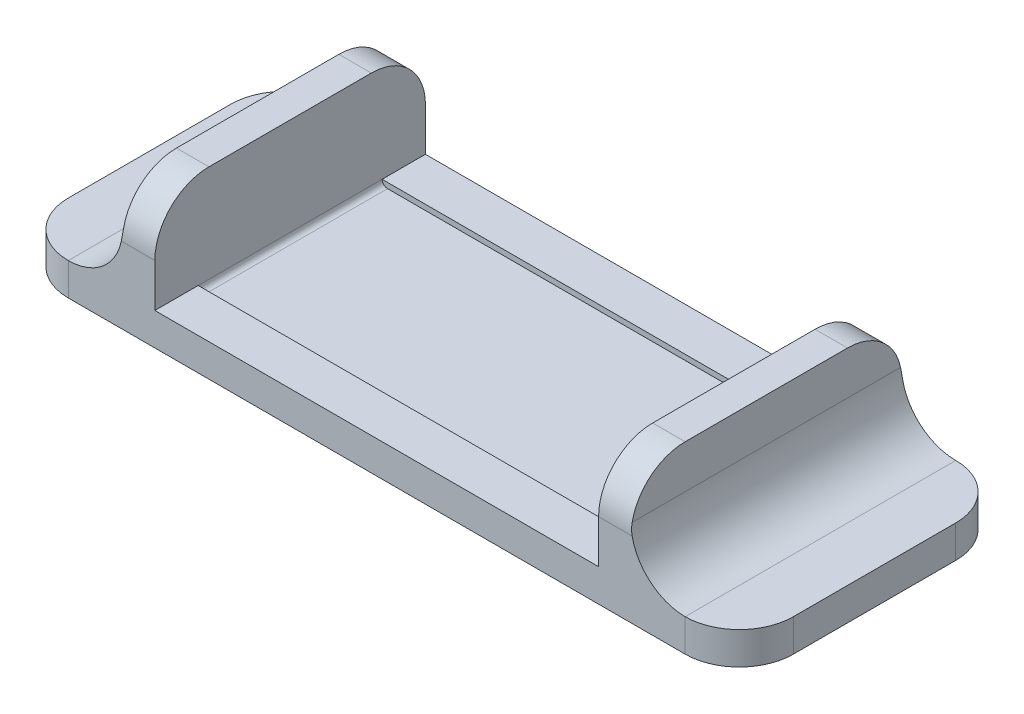
ISO-10303-21;
HEADER;
FILE_DESCRIPTION(('STEP AP214'),'2;1');
FILE_NAME('part.step','',(''),(''),'','','');
FILE_SCHEMA(('AUTOMOTIVE_DESIGN { 1 0 10303 214 1 1 1 1 }'));
ENDSEC;
DATA;
#1=APPLICATION_CONTEXT('core data for automotive mechanical design processes');
#2=APPLICATION_PROTOCOL_DEFINITION('international standard','automotive_design',2000,#1);
#3=PRODUCT_CONTEXT('',#1,'mechanical');
#4=PRODUCT('Part','Part','',(#3));
#5=PRODUCT_RELATED_PRODUCT_CATEGORY('part','',(#4));
#6=PRODUCT_DEFINITION_FORMATION('','',#4);
#7=PRODUCT_DEFINITION_CONTEXT('part definition',#1,'design');
#8=PRODUCT_DEFINITION('design','',#6,#7);
#9=PRODUCT_DEFINITION_SHAPE('','',#8);
#10=(LENGTH_UNIT() NAMED_UNIT(*) SI_UNIT(.MILLI.,.METRE.));
#11=(NAMED_UNIT(*) PLANE_ANGLE_UNIT() SI_UNIT($,.RADIAN.));
#12=(NAMED_UNIT(*) SI_UNIT($,.STERADIAN.) SOLID_ANGLE_UNIT());
#13=UNCERTAINTY_MEASURE_WITH_UNIT(LENGTH_MEASURE(1.E-05),#10,'distance_accuracy_value','');
#14=(GEOMETRIC_REPRESENTATION_CONTEXT(3) GLOBAL_UNCERTAINTY_ASSIGNED_CONTEXT((#13)) GLOBAL_UNIT_ASSIGNED_CONTEXT((#10,
#11,#12)) REPRESENTATION_CONTEXT('',''));
#15=CARTESIAN_POINT('',(0.,0.,0.));
#16=DIRECTION('',(0.,0.,1.));
#17=DIRECTION('',(1.,0.,0.));
#18=AXIS2_PLACEMENT_3D('',#15,#16,#17);
#19=CARTESIAN_POINT('',(0.,0.,50.));
#20=DIRECTION('',(0.,-1.,0.));
#21=DIRECTION('',(0.,0.,-1.));
#22=AXIS2_PLACEMENT_3D('',#19,#20,#21);
#23=PLANE('',#22);
#24=DIRECTION('',(1.,0.,0.));
#25=VECTOR('',#24,1.);
#26=CARTESIAN_POINT('',(0.,0.,8.));
#27=LINE('',#26,#25);
#28=CARTESIAN_POINT('',(0.,0.,8.));
#29=VERTEX_POINT('',#28);
#30=CARTESIAN_POINT('',(82.,0.,8.));
#31=VERTEX_POINT('',#30);
#32=EDGE_CURVE('E219',#29,#31,#27,.T.);
#33=ORIENTED_EDGE('',*,*,#32,.T.);
#34=DIRECTION('',(0.,0.,-1.));
#35=VECTOR('',#34,1.);
#36=CARTESIAN_POINT('',(82.,0.,50.));
#37=LINE('',#36,#35);
#38=CARTESIAN_POINT('',(82.,0.,0.));
#39=VERTEX_POINT('',#38);
#40=EDGE_CURVE('E206',#31,#39,#37,.T.);
#41=ORIENTED_EDGE('',*,*,#40,.T.);
#42=DIRECTION('',(-1.,0.,0.));
#43=VECTOR('',#42,1.);
#44=CARTESIAN_POINT('',(0.,0.,0.));
#45=LINE('',#44,#43);
#46=CARTESIAN_POINT('',(0.,0.,0.));
#47=VERTEX_POINT('',#46);
#48=EDGE_CURVE('E477',#39,#47,#45,.T.);
#49=ORIENTED_EDGE('',*,*,#48,.T.);
#50=DIRECTION('',(0.,0.,-1.));
#51=VECTOR('',#50,1.);
#52=CARTESIAN_POINT('',(0.,0.,50.));
#53=LINE('',#52,#51);
#54=EDGE_CURVE('E486',#29,#47,#53,.T.);
#55=ORIENTED_EDGE('',*,*,#54,.F.);
#56=EDGE_LOOP('',(#33,#41,#49,#55));
#57=FACE_BOUND('',#56,.T.);
#58=ADVANCED_FACE('F35',(#57),#23,.F.);
#59=CARTESIAN_POINT('',(0.,0.,50.));
#60=DIRECTION('',(-1.,0.,0.));
#61=DIRECTION('',(0.,0.,1.));
#62=AXIS2_PLACEMENT_3D('',#59,#60,#61);
#63=PLANE('',#62);
#64=CARTESIAN_POINT('',(0.,0.,50.));
#65=VERTEX_POINT('',#64);
#66=CARTESIAN_POINT('',(0.,0.,42.));
#67=VERTEX_POINT('',#66);
#68=EDGE_CURVE('E485',#65,#67,#53,.T.);
#69=ORIENTED_EDGE('',*,*,#68,.T.);
#70=DIRECTION('',(0.,0.,1.));
#71=VECTOR('',#70,1.);
#72=CARTESIAN_POINT('',(0.,0.,50.));
#73=LINE('',#72,#71);
#74=EDGE_CURVE('E11',#67,#29,#73,.F.);
#75=ORIENTED_EDGE('',*,*,#74,.T.);
#76=ORIENTED_EDGE('',*,*,#54,.T.);
#77=DIRECTION('',(0.,1.,0.));
#78=VECTOR('',#77,1.);
#79=CARTESIAN_POINT('',(0.,0.,0.));
#80=LINE('',#79,#78);
#81=CARTESIAN_POINT('',(0.,8.,0.));
#82=VERTEX_POINT('',#81);
#83=EDGE_CURVE('E475',#47,#82,#80,.T.);
#84=ORIENTED_EDGE('',*,*,#83,.T.);
#85=CARTESIAN_POINT('',(0.,8.,10.));
#86=DIRECTION('',(-1.,0.,0.));
#87=DIRECTION('',(0.,0.,1.));
#88=AXIS2_PLACEMENT_3D('',#85,#86,#87);
#89=CIRCLE('',#88,10.);
#90=CARTESIAN_POINT('',(0.,18.,10.));
#91=VERTEX_POINT('',#90);
#92=EDGE_CURVE('E235',#82,#91,#89,.F.);
#93=ORIENTED_EDGE('',*,*,#92,.T.);
#94=DIRECTION('',(0.,0.,-1.));
#95=VECTOR('',#94,1.);
#96=CARTESIAN_POINT('',(0.,18.,50.));
#97=LINE('',#96,#95);
#98=CARTESIAN_POINT('',(0.,18.,40.));
#99=VERTEX_POINT('',#98);
#100=EDGE_CURVE('E335',#99,#91,#97,.T.);
#101=ORIENTED_EDGE('',*,*,#100,.F.);
#102=CARTESIAN_POINT('',(0.,8.,40.));
#103=DIRECTION('',(-1.,0.,0.));
#104=DIRECTION('',(0.,0.,1.));
#105=AXIS2_PLACEMENT_3D('',#102,#103,#104);
#106=CIRCLE('',#105,10.);
#107=CARTESIAN_POINT('',(0.,8.,50.));
#108=VERTEX_POINT('',#107);
#109=EDGE_CURVE('E237',#99,#108,#106,.F.);
#110=ORIENTED_EDGE('',*,*,#109,.T.);
#111=DIRECTION('',(0.,1.,0.));
#112=VECTOR('',#111,1.);
#113=CARTESIAN_POINT('',(0.,0.,50.));
#114=LINE('',#113,#112);
#115=EDGE_CURVE('E484',#65,#108,#114,.T.);
#116=ORIENTED_EDGE('',*,*,#115,.F.);
#117=EDGE_LOOP('',(#69,#75,#76,#84,#93,#101,#110,#116));
#118=FACE_BOUND('',#117,.T.);
#119=ADVANCED_FACE('F339',(#118),#63,.F.);
#120=CARTESIAN_POINT('',(-6.,18.,50.));
#121=DIRECTION('',(0.,-1.,0.));
#122=DIRECTION('',(0.,0.,-1.));
#123=AXIS2_PLACEMENT_3D('',#120,#121,#122);
#124=PLANE('',#123);
#125=ORIENTED_EDGE('',*,*,#100,.T.);
#126=DIRECTION('',(-1.,0.,0.));
#127=VECTOR('',#126,1.);
#128=CARTESIAN_POINT('',(-6.,18.,10.));
#129=LINE('',#128,#127);
#130=CARTESIAN_POINT('',(-6.,18.,10.));
#131=VERTEX_POINT('',#130);
#132=EDGE_CURVE('E305',#91,#131,#129,.T.);
#133=ORIENTED_EDGE('',*,*,#132,.T.);
#134=DIRECTION('',(0.,0.,-1.));
#135=VECTOR('',#134,1.);
#136=CARTESIAN_POINT('',(-6.,18.,50.));
#137=LINE('',#136,#135);
#138=CARTESIAN_POINT('',(-6.,18.,40.));
#139=VERTEX_POINT('',#138);
#140=EDGE_CURVE('E337',#139,#131,#137,.T.);
#141=ORIENTED_EDGE('',*,*,#140,.F.);
#142=DIRECTION('',(-1.,0.,0.));
#143=VECTOR('',#142,1.);
#144=CARTESIAN_POINT('',(-6.,18.,40.));
#145=LINE('',#144,#143);
#146=EDGE_CURVE('E303',#139,#99,#145,.F.);
#147=ORIENTED_EDGE('',*,*,#146,.T.);
#148=EDGE_LOOP('',(#125,#133,#141,#147));
#149=FACE_BOUND('',#148,.T.);
#150=ADVANCED_FACE('F334',(#149),#124,.F.);
#151=CARTESIAN_POINT('',(-6.,0.,50.));
#152=DIRECTION('',(1.,0.,0.));
#153=DIRECTION('',(0.,0.,-1.));
#154=AXIS2_PLACEMENT_3D('',#151,#152,#153);
#155=PLANE('',#154);
#156=ORIENTED_EDGE('',*,*,#140,.T.);
#157=CARTESIAN_POINT('',(-6.,8.,10.));
#158=DIRECTION('',(1.,0.,0.));
#159=DIRECTION('',(0.,0.,-1.));
#160=AXIS2_PLACEMENT_3D('',#157,#158,#159);
#161=CIRCLE('',#160,10.);
#162=CARTESIAN_POINT('',(-6.,10.,0.202041028867289));
#163=VERTEX_POINT('',#162);
#164=EDGE_CURVE('E309',#131,#163,#161,.F.);
#165=ORIENTED_EDGE('',*,*,#164,.T.);
#166=DIRECTION('',(0.,0.,-1.));
#167=VECTOR('',#166,1.);
#168=CARTESIAN_POINT('',(-6.,10.,50.));
#169=LINE('',#168,#167);
#170=CARTESIAN_POINT('',(-6.,10.,49.7979589711327));
#171=VERTEX_POINT('',#170);
#172=EDGE_CURVE('E315',#163,#171,#169,.F.);
#173=ORIENTED_EDGE('',*,*,#172,.T.);
#174=CARTESIAN_POINT('',(-6.,8.,40.));
#175=DIRECTION('',(1.,0.,0.));
#176=DIRECTION('',(0.,0.,-1.));
#177=AXIS2_PLACEMENT_3D('',#174,#175,#176);
#178=CIRCLE('',#177,10.);
#179=EDGE_CURVE('E308',#171,#139,#178,.F.);
#180=ORIENTED_EDGE('',*,*,#179,.T.);
#181=EDGE_LOOP('',(#156,#165,#173,#180));
#182=FACE_BOUND('',#181,.T.);
#183=ADVANCED_FACE('F323',(#182),#155,.F.);
#184=CARTESIAN_POINT('',(-26.,0.,50.));
#185=DIRECTION('',(0.,-1.,0.));
#186=DIRECTION('',(0.,0.,-1.));
#187=AXIS2_PLACEMENT_3D('',#184,#185,#186);
#188=PLANE('',#187);
#189=DIRECTION('',(0.,0.,-1.));
#190=VECTOR('',#189,1.);
#191=CARTESIAN_POINT('',(-16.,0.,0.));
#192=LINE('',#191,#190);
#193=CARTESIAN_POINT('',(-16.,0.,50.));
#194=VERTEX_POINT('',#193);
#195=CARTESIAN_POINT('',(-16.,0.,0.));
#196=VERTEX_POINT('',#195);
#197=EDGE_CURVE('E363',#194,#196,#192,.T.);
#198=ORIENTED_EDGE('',*,*,#197,.T.);
#199=CARTESIAN_POINT('',(-16.,0.,10.));
#200=DIRECTION('',(0.,-1.,0.));
#201=DIRECTION('',(0.,0.,-1.));
#202=AXIS2_PLACEMENT_3D('',#199,#200,#201);
#203=CIRCLE('',#202,10.);
#204=CARTESIAN_POINT('',(-26.,0.,10.));
#205=VERTEX_POINT('',#204);
#206=EDGE_CURVE('E326',#196,#205,#203,.F.);
#207=ORIENTED_EDGE('',*,*,#206,.T.);
#208=DIRECTION('',(0.,0.,-1.));
#209=VECTOR('',#208,1.);
#210=CARTESIAN_POINT('',(-26.,0.,50.));
#211=LINE('',#210,#209);
#212=CARTESIAN_POINT('',(-26.,0.,40.));
#213=VERTEX_POINT('',#212);
#214=EDGE_CURVE('E349',#213,#205,#211,.T.);
#215=ORIENTED_EDGE('',*,*,#214,.F.);
#216=CARTESIAN_POINT('',(-16.,0.,40.));
#217=DIRECTION('',(0.,-1.,0.));
#218=DIRECTION('',(0.,0.,-1.));
#219=AXIS2_PLACEMENT_3D('',#216,#217,#218);
#220=CIRCLE('',#219,10.);
#221=EDGE_CURVE('E360',#213,#194,#220,.F.);
#222=ORIENTED_EDGE('',*,*,#221,.T.);
#223=EDGE_LOOP('',(#198,#207,#215,#222));
#224=FACE_BOUND('',#223,.T.);
#225=ADVANCED_FACE('F695',(#224),#188,.F.);
#226=CARTESIAN_POINT('',(-26.,-6.,50.));
#227=DIRECTION('',(1.,0.,0.));
#228=DIRECTION('',(0.,0.,-1.));
#229=AXIS2_PLACEMENT_3D('',#226,#227,#228);
#230=PLANE('',#229);
#231=ORIENTED_EDGE('',*,*,#214,.T.);
#232=DIRECTION('',(0.,-1.,0.));
#233=VECTOR('',#232,1.);
#234=CARTESIAN_POINT('',(-26.,-6.,10.));
#235=LINE('',#234,#233);
#236=CARTESIAN_POINT('',(-26.,-6.,10.));
#237=VERTEX_POINT('',#236);
#238=EDGE_CURVE('E392',#205,#237,#235,.T.);
#239=ORIENTED_EDGE('',*,*,#238,.T.);
#240=DIRECTION('',(0.,0.,-1.));
#241=VECTOR('',#240,1.);
#242=CARTESIAN_POINT('',(-26.,-6.,50.));
#243=LINE('',#242,#241);
#244=CARTESIAN_POINT('',(-26.,-6.,40.));
#245=VERTEX_POINT('',#244);
#246=EDGE_CURVE('E452',#245,#237,#243,.T.);
#247=ORIENTED_EDGE('',*,*,#246,.F.);
#248=DIRECTION('',(0.,-1.,0.));
#249=VECTOR('',#248,1.);
#250=CARTESIAN_POINT('',(-26.,-6.,40.));
#251=LINE('',#250,#249);
#252=EDGE_CURVE('E390',#245,#213,#251,.F.);
#253=ORIENTED_EDGE('',*,*,#252,.T.);
#254=EDGE_LOOP('',(#231,#239,#247,#253));
#255=FACE_BOUND('',#254,.T.);
#256=ADVANCED_FACE('F458',(#255),#230,.F.);
#257=CARTESIAN_POINT('',(108.,-6.,50.));
#258=DIRECTION('',(0.,1.,0.));
#259=DIRECTION('',(0.,0.,1.));
#260=AXIS2_PLACEMENT_3D('',#257,#258,#259);
#261=PLANE('',#260);
#262=DIRECTION('',(1.,0.,0.));
#263=VECTOR('',#262,1.);
#264=CARTESIAN_POINT('',(108.,-6.,0.));
#265=LINE('',#264,#263);
#266=CARTESIAN_POINT('',(-16.,-6.,0.));
#267=VERTEX_POINT('',#266);
#268=CARTESIAN_POINT('',(98.,-6.,0.));
#269=VERTEX_POINT('',#268);
#270=EDGE_CURVE('E469',#267,#269,#265,.T.);
#271=ORIENTED_EDGE('',*,*,#270,.T.);
#272=CARTESIAN_POINT('',(98.,-6.,10.));
#273=DIRECTION('',(0.,1.,0.));
#274=DIRECTION('',(0.,0.,1.));
#275=AXIS2_PLACEMENT_3D('',#272,#273,#274);
#276=CIRCLE('',#275,10.);
#277=CARTESIAN_POINT('',(108.,-6.,10.));
#278=VERTEX_POINT('',#277);
#279=EDGE_CURVE('E382',#269,#278,#276,.F.);
#280=ORIENTED_EDGE('',*,*,#279,.T.);
#281=DIRECTION('',(0.,0.,-1.));
#282=VECTOR('',#281,1.);
#283=CARTESIAN_POINT('',(108.,-6.,50.));
#284=LINE('',#283,#282);
#285=CARTESIAN_POINT('',(108.,-6.,40.));
#286=VERTEX_POINT('',#285);
#287=EDGE_CURVE('E449',#286,#278,#284,.T.);
#288=ORIENTED_EDGE('',*,*,#287,.F.);
#289=CARTESIAN_POINT('',(98.,-6.,40.));
#290=DIRECTION('',(0.,1.,0.));
#291=DIRECTION('',(0.,0.,1.));
#292=AXIS2_PLACEMENT_3D('',#289,#290,#291);
#293=CIRCLE('',#292,10.);
#294=CARTESIAN_POINT('',(98.,-6.,50.));
#295=VERTEX_POINT('',#294);
#296=EDGE_CURVE('E380',#286,#295,#293,.F.);
#297=ORIENTED_EDGE('',*,*,#296,.T.);
#298=DIRECTION('',(1.,0.,0.));
#299=VECTOR('',#298,1.);
#300=CARTESIAN_POINT('',(-6.,-6.,50.));
#301=LINE('',#300,#299);
#302=CARTESIAN_POINT('',(-16.,-6.,50.));
#303=VERTEX_POINT('',#302);
#304=EDGE_CURVE('E491',#303,#295,#301,.T.);
#305=ORIENTED_EDGE('',*,*,#304,.F.);
#306=CARTESIAN_POINT('',(-16.,-6.,40.));
#307=DIRECTION('',(0.,1.,0.));
#308=DIRECTION('',(0.,0.,1.));
#309=AXIS2_PLACEMENT_3D('',#306,#307,#308);
#310=CIRCLE('',#309,10.);
#311=EDGE_CURVE('E376',#303,#245,#310,.F.);
#312=ORIENTED_EDGE('',*,*,#311,.T.);
#313=ORIENTED_EDGE('',*,*,#246,.T.);
#314=CARTESIAN_POINT('',(-16.,-6.,10.));
#315=DIRECTION('',(0.,1.,0.));
#316=DIRECTION('',(0.,0.,1.));
#317=AXIS2_PLACEMENT_3D('',#314,#315,#316);
#318=CIRCLE('',#317,10.);
#319=EDGE_CURVE('E378',#237,#267,#318,.F.);
#320=ORIENTED_EDGE('',*,*,#319,.T.);
#321=EDGE_LOOP('',(#271,#280,#288,#297,#305,#312,#313,#320));
#322=FACE_BOUND('',#321,.T.);
#323=ADVANCED_FACE('F468',(#322),#261,.F.);
#324=CARTESIAN_POINT('',(108.,0.,50.));
#325=DIRECTION('',(-1.,0.,0.));
#326=DIRECTION('',(0.,0.,1.));
#327=AXIS2_PLACEMENT_3D('',#324,#325,#326);
#328=PLANE('',#327);
#329=ORIENTED_EDGE('',*,*,#287,.T.);
#330=DIRECTION('',(0.,1.,0.));
#331=VECTOR('',#330,1.);
#332=CARTESIAN_POINT('',(108.,0.,10.));
#333=LINE('',#332,#331);
#334=CARTESIAN_POINT('',(108.,0.,10.));
#335=VERTEX_POINT('',#334);
#336=EDGE_CURVE('E368',#278,#335,#333,.T.);
#337=ORIENTED_EDGE('',*,*,#336,.T.);
#338=DIRECTION('',(0.,0.,-1.));
#339=VECTOR('',#338,1.);
#340=CARTESIAN_POINT('',(108.,0.,50.));
#341=LINE('',#340,#339);
#342=CARTESIAN_POINT('',(108.,0.,40.));
#343=VERTEX_POINT('',#342);
#344=EDGE_CURVE('E443',#343,#335,#341,.T.);
#345=ORIENTED_EDGE('',*,*,#344,.F.);
#346=DIRECTION('',(0.,1.,0.));
#347=VECTOR('',#346,1.);
#348=CARTESIAN_POINT('',(108.,0.,40.));
#349=LINE('',#348,#347);
#350=EDGE_CURVE('E325',#343,#286,#349,.F.);
#351=ORIENTED_EDGE('',*,*,#350,.T.);
#352=EDGE_LOOP('',(#329,#337,#345,#351));
#353=FACE_BOUND('',#352,.T.);
#354=ADVANCED_FACE('F525',(#353),#328,.F.);
#355=CARTESIAN_POINT('',(88.,0.,50.));
#356=DIRECTION('',(0.,-1.,0.));
#357=DIRECTION('',(0.,0.,-1.));
#358=AXIS2_PLACEMENT_3D('',#355,#356,#357);
#359=PLANE('',#358);
#360=ORIENTED_EDGE('',*,*,#344,.T.);
#361=CARTESIAN_POINT('',(98.,0.,10.));
#362=DIRECTION('',(0.,-1.,0.));
#363=DIRECTION('',(0.,0.,-1.));
#364=AXIS2_PLACEMENT_3D('',#361,#362,#363);
#365=CIRCLE('',#364,10.);
#366=CARTESIAN_POINT('',(98.,0.,0.));
#367=VERTEX_POINT('',#366);
#368=EDGE_CURVE('E357',#335,#367,#365,.F.);
#369=ORIENTED_EDGE('',*,*,#368,.T.);
#370=DIRECTION('',(0.,0.,-1.));
#371=VECTOR('',#370,1.);
#372=CARTESIAN_POINT('',(98.,0.,50.));
#373=LINE('',#372,#371);
#374=CARTESIAN_POINT('',(98.,0.,50.));
#375=VERTEX_POINT('',#374);
#376=EDGE_CURVE('E354',#367,#375,#373,.F.);
#377=ORIENTED_EDGE('',*,*,#376,.T.);
#378=CARTESIAN_POINT('',(98.,0.,40.));
#379=DIRECTION('',(0.,-1.,0.));
#380=DIRECTION('',(0.,0.,-1.));
#381=AXIS2_PLACEMENT_3D('',#378,#379,#380);
#382=CIRCLE('',#381,10.);
#383=EDGE_CURVE('E347',#375,#343,#382,.F.);
#384=ORIENTED_EDGE('',*,*,#383,.T.);
#385=EDGE_LOOP('',(#360,#369,#377,#384));
#386=FACE_BOUND('',#385,.T.);
#387=ADVANCED_FACE('F521',(#386),#359,.F.);
#388=CARTESIAN_POINT('',(88.,18.,50.));
#389=DIRECTION('',(-1.,0.,0.));
#390=DIRECTION('',(0.,0.,1.));
#391=AXIS2_PLACEMENT_3D('',#388,#389,#390);
#392=PLANE('',#391);
#393=DIRECTION('',(0.,0.,-1.));
#394=VECTOR('',#393,1.);
#395=CARTESIAN_POINT('',(88.,18.,50.));
#396=LINE('',#395,#394);
#397=CARTESIAN_POINT('',(88.,18.,40.));
#398=VERTEX_POINT('',#397);
#399=CARTESIAN_POINT('',(88.,18.,10.));
#400=VERTEX_POINT('',#399);
#401=EDGE_CURVE('E440',#398,#400,#396,.T.);
#402=ORIENTED_EDGE('',*,*,#401,.F.);
#403=CARTESIAN_POINT('',(88.,8.,40.));
#404=DIRECTION('',(-1.,0.,0.));
#405=DIRECTION('',(0.,0.,1.));
#406=AXIS2_PLACEMENT_3D('',#403,#404,#405);
#407=CIRCLE('',#406,10.);
#408=CARTESIAN_POINT('',(88.,10.,49.7979589711327));
#409=VERTEX_POINT('',#408);
#410=EDGE_CURVE('E419',#398,#409,#407,.F.);
#411=ORIENTED_EDGE('',*,*,#410,.T.);
#412=DIRECTION('',(0.,0.,-1.));
#413=VECTOR('',#412,1.);
#414=CARTESIAN_POINT('',(88.,10.,0.));
#415=LINE('',#414,#413);
#416=CARTESIAN_POINT('',(88.,10.,0.202041028867289));
#417=VERTEX_POINT('',#416);
#418=EDGE_CURVE('E344',#409,#417,#415,.T.);
#419=ORIENTED_EDGE('',*,*,#418,.T.);
#420=CARTESIAN_POINT('',(88.,8.,10.));
#421=DIRECTION('',(-1.,0.,0.));
#422=DIRECTION('',(0.,0.,1.));
#423=AXIS2_PLACEMENT_3D('',#420,#421,#422);
#424=CIRCLE('',#423,10.);
#425=EDGE_CURVE('E418',#417,#400,#424,.F.);
#426=ORIENTED_EDGE('',*,*,#425,.T.);
#427=EDGE_LOOP('',(#402,#411,#419,#426));
#428=FACE_BOUND('',#427,.T.);
#429=ADVANCED_FACE('F432',(#428),#392,.F.);
#430=CARTESIAN_POINT('',(82.,18.,50.));
#431=DIRECTION('',(0.,-1.,0.));
#432=DIRECTION('',(0.,0.,-1.));
#433=AXIS2_PLACEMENT_3D('',#430,#431,#432);
#434=PLANE('',#433);
#435=DIRECTION('',(0.,0.,-1.));
#436=VECTOR('',#435,1.);
#437=CARTESIAN_POINT('',(82.,18.,50.));
#438=LINE('',#437,#436);
#439=CARTESIAN_POINT('',(82.,18.,40.));
#440=VERTEX_POINT('',#439);
#441=CARTESIAN_POINT('',(82.,18.,10.));
#442=VERTEX_POINT('',#441);
#443=EDGE_CURVE('E223',#440,#442,#438,.T.);
#444=ORIENTED_EDGE('',*,*,#443,.F.);
#445=DIRECTION('',(-1.,0.,0.));
#446=VECTOR('',#445,1.);
#447=CARTESIAN_POINT('',(82.,18.,40.));
#448=LINE('',#447,#446);
#449=EDGE_CURVE('E416',#440,#398,#448,.F.);
#450=ORIENTED_EDGE('',*,*,#449,.T.);
#451=ORIENTED_EDGE('',*,*,#401,.T.);
#452=DIRECTION('',(-1.,0.,0.));
#453=VECTOR('',#452,1.);
#454=CARTESIAN_POINT('',(82.,18.,10.));
#455=LINE('',#454,#453);
#456=EDGE_CURVE('E413',#400,#442,#455,.T.);
#457=ORIENTED_EDGE('',*,*,#456,.T.);
#458=EDGE_LOOP('',(#444,#450,#451,#457));
#459=FACE_BOUND('',#458,.T.);
#460=ADVANCED_FACE('F438',(#459),#434,.F.);
#461=CARTESIAN_POINT('',(82.,0.,50.));
#462=DIRECTION('',(1.,0.,0.));
#463=DIRECTION('',(0.,0.,-1.));
#464=AXIS2_PLACEMENT_3D('',#461,#462,#463);
#465=PLANE('',#464);
#466=ORIENTED_EDGE('',*,*,#40,.F.);
#467=DIRECTION('',(0.,0.,-1.));
#468=VECTOR('',#467,1.);
#469=CARTESIAN_POINT('',(82.,0.,50.));
#470=LINE('',#469,#468);
#471=CARTESIAN_POINT('',(82.,0.,42.));
#472=VERTEX_POINT('',#471);
#473=EDGE_CURVE('E198',#31,#472,#470,.F.);
#474=ORIENTED_EDGE('',*,*,#473,.T.);
#475=CARTESIAN_POINT('',(82.,0.,50.));
#476=VERTEX_POINT('',#475);
#477=EDGE_CURVE('E203',#476,#472,#37,.T.);
#478=ORIENTED_EDGE('',*,*,#477,.F.);
#479=DIRECTION('',(0.,-1.,0.));
#480=VECTOR('',#479,1.);
#481=CARTESIAN_POINT('',(82.,0.,50.));
#482=LINE('',#481,#480);
#483=CARTESIAN_POINT('',(82.,8.,50.));
#484=VERTEX_POINT('',#483);
#485=EDGE_CURVE('E489',#484,#476,#482,.T.);
#486=ORIENTED_EDGE('',*,*,#485,.F.);
#487=CARTESIAN_POINT('',(82.,8.,40.));
#488=DIRECTION('',(1.,0.,0.));
#489=DIRECTION('',(0.,0.,-1.));
#490=AXIS2_PLACEMENT_3D('',#487,#488,#489);
#491=CIRCLE('',#490,10.);
#492=EDGE_CURVE('E411',#484,#440,#491,.F.);
#493=ORIENTED_EDGE('',*,*,#492,.T.);
#494=ORIENTED_EDGE('',*,*,#443,.T.);
#495=CARTESIAN_POINT('',(82.,8.,10.));
#496=DIRECTION('',(1.,0.,0.));
#497=DIRECTION('',(0.,0.,-1.));
#498=AXIS2_PLACEMENT_3D('',#495,#496,#497);
#499=CIRCLE('',#498,10.);
#500=CARTESIAN_POINT('',(82.,8.,0.));
#501=VERTEX_POINT('',#500);
#502=EDGE_CURVE('E409',#442,#501,#499,.F.);
#503=ORIENTED_EDGE('',*,*,#502,.T.);
#504=DIRECTION('',(0.,-1.,0.));
#505=VECTOR('',#504,1.);
#506=CARTESIAN_POINT('',(82.,0.,0.));
#507=LINE('',#506,#505);
#508=EDGE_CURVE('E474',#501,#39,#507,.T.);
#509=ORIENTED_EDGE('',*,*,#508,.T.);
#510=EDGE_LOOP('',(#466,#474,#478,#486,#493,#494,#503,#509));
#511=FACE_BOUND('',#510,.T.);
#512=ADVANCED_FACE('F200',(#511),#465,.F.);
#513=ORIENTED_EDGE('',*,*,#477,.T.);
#514=DIRECTION('',(1.,0.,0.));
#515=VECTOR('',#514,1.);
#516=CARTESIAN_POINT('',(0.,0.,42.));
#517=LINE('',#516,#515);
#518=EDGE_CURVE('E212',#67,#472,#517,.T.);
#519=ORIENTED_EDGE('',*,*,#518,.F.);
#520=ORIENTED_EDGE('',*,*,#68,.F.);
#521=DIRECTION('',(-1.,0.,0.));
#522=VECTOR('',#521,1.);
#523=CARTESIAN_POINT('',(0.,0.,50.));
#524=LINE('',#523,#522);
#525=EDGE_CURVE('E222',#476,#65,#524,.T.);
#526=ORIENTED_EDGE('',*,*,#525,.F.);
#527=EDGE_LOOP('',(#513,#519,#520,#526));
#528=FACE_BOUND('',#527,.T.);
#529=ADVANCED_FACE('F221',(#528),#23,.F.);
#530=CARTESIAN_POINT('',(0.,0.,50.));
#531=DIRECTION('',(0.,0.,-1.));
#532=DIRECTION('',(-1.,0.,0.));
#533=AXIS2_PLACEMENT_3D('',#530,#531,#532);
#534=PLANE('',#533);
#535=CARTESIAN_POINT('',(98.,10.,50.));
#536=DIRECTION('',(0.,0.,-1.));
#537=DIRECTION('',(-1.,0.,0.));
#538=AXIS2_PLACEMENT_3D('',#535,#536,#537);
#539=CIRCLE('',#538,10.);
#540=CARTESIAN_POINT('',(88.2020410288673,8.,50.));
#541=VERTEX_POINT('',#540);
#542=EDGE_CURVE('E397',#375,#541,#539,.T.);
#543=ORIENTED_EDGE('',*,*,#542,.T.);
#544=DIRECTION('',(-1.,0.,0.));
#545=VECTOR('',#544,1.);
#546=CARTESIAN_POINT('',(0.,8.,50.));
#547=LINE('',#546,#545);
#548=EDGE_CURVE('E406',#541,#484,#547,.T.);
#549=ORIENTED_EDGE('',*,*,#548,.T.);
#550=ORIENTED_EDGE('',*,*,#485,.T.);
#551=ORIENTED_EDGE('',*,*,#525,.T.);
#552=ORIENTED_EDGE('',*,*,#115,.T.);
#553=DIRECTION('',(-1.,0.,0.));
#554=VECTOR('',#553,1.);
#555=CARTESIAN_POINT('',(0.,8.,50.));
#556=LINE('',#555,#554);
#557=CARTESIAN_POINT('',(-6.20204102886729,8.,50.));
#558=VERTEX_POINT('',#557);
#559=EDGE_CURVE('E404',#108,#558,#556,.T.);
#560=ORIENTED_EDGE('',*,*,#559,.T.);
#561=CARTESIAN_POINT('',(-16.,10.,50.));
#562=DIRECTION('',(0.,0.,-1.));
#563=DIRECTION('',(-1.,0.,0.));
#564=AXIS2_PLACEMENT_3D('',#561,#562,#563);
#565=CIRCLE('',#564,10.);
#566=EDGE_CURVE('E318',#558,#194,#565,.T.);
#567=ORIENTED_EDGE('',*,*,#566,.T.);
#568=DIRECTION('',(0.,-1.,0.));
#569=VECTOR('',#568,1.);
#570=CARTESIAN_POINT('',(-16.,0.,50.));
#571=LINE('',#570,#569);
#572=EDGE_CURVE('E384',#194,#303,#571,.T.);
#573=ORIENTED_EDGE('',*,*,#572,.T.);
#574=ORIENTED_EDGE('',*,*,#304,.T.);
#575=DIRECTION('',(0.,1.,0.));
#576=VECTOR('',#575,1.);
#577=CARTESIAN_POINT('',(98.,0.,50.));
#578=LINE('',#577,#576);
#579=EDGE_CURVE('E387',#295,#375,#578,.T.);
#580=ORIENTED_EDGE('',*,*,#579,.T.);
#581=EDGE_LOOP('',(#543,#549,#550,#551,#552,#560,#567,#573,#574,#580));
#582=FACE_BOUND('',#581,.T.);
#583=ADVANCED_FACE('F513',(#582),#534,.F.);
#584=CARTESIAN_POINT('',(0.,0.,0.));
#585=DIRECTION('',(0.,0.,-1.));
#586=DIRECTION('',(-1.,0.,0.));
#587=AXIS2_PLACEMENT_3D('',#584,#585,#586);
#588=PLANE('',#587);
#589=ORIENTED_EDGE('',*,*,#508,.F.);
#590=DIRECTION('',(-1.,0.,0.));
#591=VECTOR('',#590,1.);
#592=CARTESIAN_POINT('',(88.,8.,0.));
#593=LINE('',#592,#591);
#594=CARTESIAN_POINT('',(88.2020410288673,8.,0.));
#595=VERTEX_POINT('',#594);
#596=EDGE_CURVE('E301',#501,#595,#593,.F.);
#597=ORIENTED_EDGE('',*,*,#596,.T.);
#598=CARTESIAN_POINT('',(98.,10.,0.));
#599=DIRECTION('',(0.,0.,-1.));
#600=DIRECTION('',(-1.,0.,0.));
#601=AXIS2_PLACEMENT_3D('',#598,#599,#600);
#602=CIRCLE('',#601,10.);
#603=EDGE_CURVE('E395',#595,#367,#602,.F.);
#604=ORIENTED_EDGE('',*,*,#603,.T.);
#605=DIRECTION('',(0.,1.,0.));
#606=VECTOR('',#605,1.);
#607=CARTESIAN_POINT('',(98.,-6.,0.));
#608=LINE('',#607,#606);
#609=EDGE_CURVE('E374',#367,#269,#608,.F.);
#610=ORIENTED_EDGE('',*,*,#609,.T.);
#611=ORIENTED_EDGE('',*,*,#270,.F.);
#612=DIRECTION('',(0.,-1.,0.));
#613=VECTOR('',#612,1.);
#614=CARTESIAN_POINT('',(-16.,0.,0.));
#615=LINE('',#614,#613);
#616=EDGE_CURVE('E371',#267,#196,#615,.F.);
#617=ORIENTED_EDGE('',*,*,#616,.T.);
#618=CARTESIAN_POINT('',(-16.,10.,0.));
#619=DIRECTION('',(0.,0.,-1.));
#620=DIRECTION('',(-1.,0.,0.));
#621=AXIS2_PLACEMENT_3D('',#618,#619,#620);
#622=CIRCLE('',#621,10.);
#623=CARTESIAN_POINT('',(-6.20204102886729,8.,0.));
#624=VERTEX_POINT('',#623);
#625=EDGE_CURVE('E400',#196,#624,#622,.F.);
#626=ORIENTED_EDGE('',*,*,#625,.T.);
#627=DIRECTION('',(-1.,0.,0.));
#628=VECTOR('',#627,1.);
#629=CARTESIAN_POINT('',(0.,8.,0.));
#630=LINE('',#629,#628);
#631=EDGE_CURVE('E294',#624,#82,#630,.F.);
#632=ORIENTED_EDGE('',*,*,#631,.T.);
#633=ORIENTED_EDGE('',*,*,#83,.F.);
#634=ORIENTED_EDGE('',*,*,#48,.F.);
#635=EDGE_LOOP('',(#589,#597,#604,#610,#611,#617,#626,#632,#633,#634));
#636=FACE_BOUND('',#635,.T.);
#637=ADVANCED_FACE('F472',(#636),#588,.T.);
#638=CARTESIAN_POINT('',(98.,10.,50.));
#639=DIRECTION('',(0.,0.,1.));
#640=DIRECTION('',(1.,0.,0.));
#641=AXIS2_PLACEMENT_3D('',#638,#639,#640);
#642=CYLINDRICAL_SURFACE('',#641,10.);
#643=ORIENTED_EDGE('',*,*,#418,.F.);
#644=CARTESIAN_POINT('',(88.,10.,49.7979589711327));
#645=CARTESIAN_POINT('',(87.9999819448078,9.83407414881163,49.8318471881189));
#646=CARTESIAN_POINT('',(88.0041297977745,9.66727516703967,49.8614855008327));
#647=CARTESIAN_POINT('',(88.0208396178367,9.33364787559217,49.9120944113021));
#648=CARTESIAN_POINT('',(88.0333591362185,9.16682393779609,49.9331078783509));
#649=CARTESIAN_POINT('',(88.0668921216491,8.83317606220391,49.9666408637815));
#650=CARTESIAN_POINT('',(88.0879055886979,8.66635212440783,49.9791603821633));
#651=CARTESIAN_POINT('',(88.1385144991672,8.33272483296033,49.9958702022255));
#652=CARTESIAN_POINT('',(88.1681528118811,8.16592585118837,50.0000180551922));
#653=CARTESIAN_POINT('',(88.2020410288673,8.,50.));
#654=B_SPLINE_CURVE_WITH_KNOTS('',3,(#644,#645,#646,#647,#648,#649,#650,#651,#652,#653),
.UNSPECIFIED.,.F.,.F.,(4,2,2,2,4),(0.,0.507954686551305,1.01335311303166,1.51875153951202,
2.02670622606332),.UNSPECIFIED.);
#655=EDGE_CURVE('E288',#409,#541,#654,.T.);
#656=ORIENTED_EDGE('',*,*,#655,.T.);
#657=ORIENTED_EDGE('',*,*,#542,.F.);
#658=ORIENTED_EDGE('',*,*,#376,.F.);
#659=ORIENTED_EDGE('',*,*,#603,.F.);
#660=CARTESIAN_POINT('',(88.2020410288673,8.,0.));
#661=CARTESIAN_POINT('',(88.1681528118811,8.16592585118837,-1.8055192164459E-05));
#662=CARTESIAN_POINT('',(88.1385144991672,8.33272483296033,0.00412979777446972));
#663=CARTESIAN_POINT('',(88.0879055886979,8.66635212440783,0.0208396178366635));
#664=CARTESIAN_POINT('',(88.0668921216491,8.83317606220391,0.0333591362184974));
#665=CARTESIAN_POINT('',(88.0333591362185,9.16682393779608,0.0668921216491066));
#666=CARTESIAN_POINT('',(88.0208396178367,9.33364787559217,0.0879055886978818));
#667=CARTESIAN_POINT('',(88.0041297977745,9.66727516703967,0.138514499167255));
#668=CARTESIAN_POINT('',(87.9999819448078,9.83407414881162,0.168152811881146));
#669=CARTESIAN_POINT('',(88.,10.,0.202041028867289));
#670=B_SPLINE_CURVE_WITH_KNOTS('',3,(#660,#661,#662,#663,#664,#665,#666,#667,#668,#669),
.UNSPECIFIED.,.F.,.F.,(4,2,2,2,4),(0.,0.507954686551305,1.01335311303166,1.51875153951202,
2.02670622606332),.UNSPECIFIED.);
#671=EDGE_CURVE('E295',#595,#417,#670,.T.);
#672=ORIENTED_EDGE('',*,*,#671,.T.);
#673=EDGE_LOOP('',(#643,#656,#657,#658,#659,#672));
#674=FACE_BOUND('',#673,.T.);
#675=ADVANCED_FACE('F261',(#674),#642,.F.);
#676=CARTESIAN_POINT('',(-16.,10.,50.));
#677=DIRECTION('',(0.,0.,1.));
#678=DIRECTION('',(1.,0.,0.));
#679=AXIS2_PLACEMENT_3D('',#676,#677,#678);
#680=CYLINDRICAL_SURFACE('',#679,10.);
#681=ORIENTED_EDGE('',*,*,#172,.F.);
#682=CARTESIAN_POINT('',(-6.,10.,0.202041028867289));
#683=CARTESIAN_POINT('',(-5.99998194480784,9.83407414881163,0.168152811881147));
#684=CARTESIAN_POINT('',(-6.00412979777447,9.66727516703967,0.138514499167256));
#685=CARTESIAN_POINT('',(-6.02083961783666,9.33364787559217,0.0879055886978815));
#686=CARTESIAN_POINT('',(-6.0333591362185,9.16682393779609,0.0668921216491051));
#687=CARTESIAN_POINT('',(-6.0668921216491,8.83317606220391,0.0333591362184962));
#688=CARTESIAN_POINT('',(-6.08790558869788,8.66635212440783,0.0208396178366637));
#689=CARTESIAN_POINT('',(-6.13851449916725,8.33272483296033,0.00412979777447181));
#690=CARTESIAN_POINT('',(-6.16815281188115,8.16592585118837,-1.80551921618161E-05));
#691=CARTESIAN_POINT('',(-6.20204102886729,8.,0.));
#692=B_SPLINE_CURVE_WITH_KNOTS('',3,(#682,#683,#684,#685,#686,#687,#688,#689,#690,#691),
.UNSPECIFIED.,.F.,.F.,(4,2,2,2,4),(0.,0.507954686551306,1.01335311303166,1.51875153951202,
2.02670622606333),.UNSPECIFIED.);
#693=EDGE_CURVE('E239',#163,#624,#692,.T.);
#694=ORIENTED_EDGE('',*,*,#693,.T.);
#695=ORIENTED_EDGE('',*,*,#625,.F.);
#696=ORIENTED_EDGE('',*,*,#197,.F.);
#697=ORIENTED_EDGE('',*,*,#566,.F.);
#698=CARTESIAN_POINT('',(-6.20204102886729,8.,50.));
#699=CARTESIAN_POINT('',(-6.16815281188115,8.16592585118837,50.0000180551922));
#700=CARTESIAN_POINT('',(-6.13851449916725,8.33272483296033,49.9958702022255));
#701=CARTESIAN_POINT('',(-6.08790558869788,8.66635212440783,49.9791603821633));
#702=CARTESIAN_POINT('',(-6.06689212164911,8.83317606220391,49.9666408637815));
#703=CARTESIAN_POINT('',(-6.0333591362185,9.16682393779609,49.9331078783509));
#704=CARTESIAN_POINT('',(-6.02083961783666,9.33364787559217,49.9120944113021));
#705=CARTESIAN_POINT('',(-6.00412979777447,9.66727516703967,49.8614855008327));
#706=CARTESIAN_POINT('',(-5.99998194480784,9.83407414881163,49.8318471881189));
#707=CARTESIAN_POINT('',(-6.,10.,49.7979589711327));
#708=B_SPLINE_CURVE_WITH_KNOTS('',3,(#698,#699,#700,#701,#702,#703,#704,#705,#706,#707),
.UNSPECIFIED.,.F.,.F.,(4,2,2,2,4),(0.,0.507954686551306,1.01335311303166,1.51875153951202,
2.02670622606333),.UNSPECIFIED.);
#709=EDGE_CURVE('E246',#558,#171,#708,.T.);
#710=ORIENTED_EDGE('',*,*,#709,.T.);
#711=EDGE_LOOP('',(#681,#694,#695,#696,#697,#710));
#712=FACE_BOUND('',#711,.T.);
#713=ADVANCED_FACE('F255',(#712),#680,.F.);
#714=CARTESIAN_POINT('',(98.,0.,10.));
#715=DIRECTION('',(0.,-1.,0.));
#716=DIRECTION('',(0.,0.,-1.));
#717=AXIS2_PLACEMENT_3D('',#714,#715,#716);
#718=CYLINDRICAL_SURFACE('',#717,10.);
#719=ORIENTED_EDGE('',*,*,#279,.F.);
#720=ORIENTED_EDGE('',*,*,#609,.F.);
#721=ORIENTED_EDGE('',*,*,#368,.F.);
#722=ORIENTED_EDGE('',*,*,#336,.F.);
#723=EDGE_LOOP('',(#719,#720,#721,#722));
#724=FACE_BOUND('',#723,.T.);
#725=ADVANCED_FACE('F260',(#724),#718,.T.);
#726=CARTESIAN_POINT('',(98.,0.,40.));
#727=DIRECTION('',(0.,1.,0.));
#728=DIRECTION('',(0.,0.,1.));
#729=AXIS2_PLACEMENT_3D('',#726,#727,#728);
#730=CYLINDRICAL_SURFACE('',#729,10.);
#731=ORIENTED_EDGE('',*,*,#296,.F.);
#732=ORIENTED_EDGE('',*,*,#350,.F.);
#733=ORIENTED_EDGE('',*,*,#383,.F.);
#734=ORIENTED_EDGE('',*,*,#579,.F.);
#735=EDGE_LOOP('',(#731,#732,#733,#734));
#736=FACE_BOUND('',#735,.T.);
#737=ADVANCED_FACE('F268',(#736),#730,.T.);
#738=CARTESIAN_POINT('',(-16.,-6.,10.));
#739=DIRECTION('',(0.,1.,0.));
#740=DIRECTION('',(0.,0.,1.));
#741=AXIS2_PLACEMENT_3D('',#738,#739,#740);
#742=CYLINDRICAL_SURFACE('',#741,10.);
#743=ORIENTED_EDGE('',*,*,#206,.F.);
#744=ORIENTED_EDGE('',*,*,#616,.F.);
#745=ORIENTED_EDGE('',*,*,#319,.F.);
#746=ORIENTED_EDGE('',*,*,#238,.F.);
#747=EDGE_LOOP('',(#743,#744,#745,#746));
#748=FACE_BOUND('',#747,.T.);
#749=ADVANCED_FACE('F272',(#748),#742,.T.);
#750=CARTESIAN_POINT('',(-16.,0.,40.));
#751=DIRECTION('',(0.,-1.,0.));
#752=DIRECTION('',(0.,0.,-1.));
#753=AXIS2_PLACEMENT_3D('',#750,#751,#752);
#754=CYLINDRICAL_SURFACE('',#753,10.);
#755=ORIENTED_EDGE('',*,*,#221,.F.);
#756=ORIENTED_EDGE('',*,*,#252,.F.);
#757=ORIENTED_EDGE('',*,*,#311,.F.);
#758=ORIENTED_EDGE('',*,*,#572,.F.);
#759=EDGE_LOOP('',(#755,#756,#757,#758));
#760=FACE_BOUND('',#759,.T.);
#761=ADVANCED_FACE('F276',(#760),#754,.T.);
#762=CARTESIAN_POINT('',(0.,8.,40.));
#763=DIRECTION('',(-1.,0.,0.));
#764=DIRECTION('',(0.,0.,1.));
#765=AXIS2_PLACEMENT_3D('',#762,#763,#764);
#766=CYLINDRICAL_SURFACE('',#765,10.);
#767=ORIENTED_EDGE('',*,*,#410,.F.);
#768=ORIENTED_EDGE('',*,*,#449,.F.);
#769=ORIENTED_EDGE('',*,*,#492,.F.);
#770=ORIENTED_EDGE('',*,*,#548,.F.);
#771=ORIENTED_EDGE('',*,*,#655,.F.);
#772=EDGE_LOOP('',(#767,#768,#769,#770,#771));
#773=FACE_BOUND('',#772,.T.);
#774=ADVANCED_FACE('F280',(#773),#766,.T.);
#775=CARTESIAN_POINT('',(82.,8.,10.));
#776=DIRECTION('',(1.,0.,0.));
#777=DIRECTION('',(0.,0.,-1.));
#778=AXIS2_PLACEMENT_3D('',#775,#776,#777);
#779=CYLINDRICAL_SURFACE('',#778,10.);
#780=ORIENTED_EDGE('',*,*,#671,.F.);
#781=ORIENTED_EDGE('',*,*,#596,.F.);
#782=ORIENTED_EDGE('',*,*,#502,.F.);
#783=ORIENTED_EDGE('',*,*,#456,.F.);
#784=ORIENTED_EDGE('',*,*,#425,.F.);
#785=EDGE_LOOP('',(#780,#781,#782,#783,#784));
#786=FACE_BOUND('',#785,.T.);
#787=ADVANCED_FACE('F284',(#786),#779,.T.);
#788=CARTESIAN_POINT('',(-6.,8.,10.));
#789=DIRECTION('',(1.,0.,0.));
#790=DIRECTION('',(0.,0.,-1.));
#791=AXIS2_PLACEMENT_3D('',#788,#789,#790);
#792=CYLINDRICAL_SURFACE('',#791,10.);
#793=ORIENTED_EDGE('',*,*,#92,.F.);
#794=ORIENTED_EDGE('',*,*,#631,.F.);
#795=ORIENTED_EDGE('',*,*,#693,.F.);
#796=ORIENTED_EDGE('',*,*,#164,.F.);
#797=ORIENTED_EDGE('',*,*,#132,.F.);
#798=EDGE_LOOP('',(#793,#794,#795,#796,#797));
#799=FACE_BOUND('',#798,.T.);
#800=ADVANCED_FACE('F252',(#799),#792,.T.);
#801=CARTESIAN_POINT('',(0.,8.,40.));
#802=DIRECTION('',(-1.,0.,0.));
#803=DIRECTION('',(0.,0.,1.));
#804=AXIS2_PLACEMENT_3D('',#801,#802,#803);
#805=CYLINDRICAL_SURFACE('',#804,10.);
#806=ORIENTED_EDGE('',*,*,#109,.F.);
#807=ORIENTED_EDGE('',*,*,#146,.F.);
#808=ORIENTED_EDGE('',*,*,#179,.F.);
#809=ORIENTED_EDGE('',*,*,#709,.F.);
#810=ORIENTED_EDGE('',*,*,#559,.F.);
#811=EDGE_LOOP('',(#806,#807,#808,#809,#810));
#812=FACE_BOUND('',#811,.T.);
#813=ADVANCED_FACE('F330',(#812),#805,.T.);
#814=CARTESIAN_POINT('',(0.,-1.,8.));
#815=DIRECTION('',(0.,0.,1.));
#816=DIRECTION('',(1.,0.,0.));
#817=AXIS2_PLACEMENT_3D('',#814,#815,#816);
#818=PLANE('',#817);
#819=DIRECTION('',(1.,0.,0.));
#820=VECTOR('',#819,1.);
#821=CARTESIAN_POINT('',(0.,-1.,8.));
#822=LINE('',#821,#820);
#823=CARTESIAN_POINT('',(1.,-1.,8.));
#824=VERTEX_POINT('',#823);
#825=CARTESIAN_POINT('',(81.,-1.,8.));
#826=VERTEX_POINT('',#825);
#827=EDGE_CURVE('E479',#824,#826,#822,.T.);
#828=ORIENTED_EDGE('',*,*,#827,.T.);
#829=CARTESIAN_POINT('',(81.,0.,8.));
#830=DIRECTION('',(0.,0.,1.));
#831=DIRECTION('',(1.,0.,0.));
#832=AXIS2_PLACEMENT_3D('',#829,#830,#831);
#833=CIRCLE('',#832,1.);
#834=EDGE_CURVE('E50',#826,#31,#833,.T.);
#835=ORIENTED_EDGE('',*,*,#834,.T.);
#836=ORIENTED_EDGE('',*,*,#32,.F.);
#837=CARTESIAN_POINT('',(1.,0.,8.));
#838=DIRECTION('',(0.,0.,1.));
#839=DIRECTION('',(1.,0.,0.));
#840=AXIS2_PLACEMENT_3D('',#837,#838,#839);
#841=CIRCLE('',#840,1.);
#842=EDGE_CURVE('E58',#29,#824,#841,.T.);
#843=ORIENTED_EDGE('',*,*,#842,.T.);
#844=EDGE_LOOP('',(#828,#835,#836,#843));
#845=FACE_BOUND('',#844,.T.);
#846=ADVANCED_FACE('F505',(#845),#818,.T.);
#847=CARTESIAN_POINT('',(0.,-1.,42.));
#848=DIRECTION('',(0.,0.,1.));
#849=DIRECTION('',(1.,0.,0.));
#850=AXIS2_PLACEMENT_3D('',#847,#848,#849);
#851=PLANE('',#850);
#852=ORIENTED_EDGE('',*,*,#518,.T.);
#853=CARTESIAN_POINT('',(81.,0.,42.));
#854=DIRECTION('',(0.,0.,1.));
#855=DIRECTION('',(1.,0.,0.));
#856=AXIS2_PLACEMENT_3D('',#853,#854,#855);
#857=CIRCLE('',#856,1.);
#858=CARTESIAN_POINT('',(81.,-1.,42.));
#859=VERTEX_POINT('',#858);
#860=EDGE_CURVE('E43',#472,#859,#857,.F.);
#861=ORIENTED_EDGE('',*,*,#860,.T.);
#862=DIRECTION('',(1.,0.,0.));
#863=VECTOR('',#862,1.);
#864=CARTESIAN_POINT('',(0.,-1.,42.));
#865=LINE('',#864,#863);
#866=CARTESIAN_POINT('',(1.,-1.,42.));
#867=VERTEX_POINT('',#866);
#868=EDGE_CURVE('E498',#867,#859,#865,.T.);
#869=ORIENTED_EDGE('',*,*,#868,.F.);
#870=CARTESIAN_POINT('',(1.,0.,42.));
#871=DIRECTION('',(0.,0.,1.));
#872=DIRECTION('',(1.,0.,0.));
#873=AXIS2_PLACEMENT_3D('',#870,#871,#872);
#874=CIRCLE('',#873,1.);
#875=EDGE_CURVE('E208',#867,#67,#874,.F.);
#876=ORIENTED_EDGE('',*,*,#875,.T.);
#877=EDGE_LOOP('',(#852,#861,#869,#876));
#878=FACE_BOUND('',#877,.T.);
#879=ADVANCED_FACE('F213',(#878),#851,.F.);
#880=CARTESIAN_POINT('',(0.,-1.,0.));
#881=DIRECTION('',(0.,1.,0.));
#882=DIRECTION('',(0.,0.,1.));
#883=AXIS2_PLACEMENT_3D('',#880,#881,#882);
#884=PLANE('',#883);
#885=ORIENTED_EDGE('',*,*,#868,.T.);
#886=DIRECTION('',(0.,0.,-1.));
#887=VECTOR('',#886,1.);
#888=CARTESIAN_POINT('',(81.,-1.,0.));
#889=LINE('',#888,#887);
#890=EDGE_CURVE('E226',#859,#826,#889,.T.);
#891=ORIENTED_EDGE('',*,*,#890,.T.);
#892=ORIENTED_EDGE('',*,*,#827,.F.);
#893=DIRECTION('',(0.,0.,1.));
#894=VECTOR('',#893,1.);
#895=CARTESIAN_POINT('',(1.,-1.,0.));
#896=LINE('',#895,#894);
#897=EDGE_CURVE('E232',#824,#867,#896,.T.);
#898=ORIENTED_EDGE('',*,*,#897,.T.);
#899=EDGE_LOOP('',(#885,#891,#892,#898));
#900=FACE_BOUND('',#899,.T.);
#901=ADVANCED_FACE('F502',(#900),#884,.T.);
#902=CARTESIAN_POINT('',(81.,0.,0.));
#903=DIRECTION('',(0.,0.,-1.));
#904=DIRECTION('',(-1.,0.,0.));
#905=AXIS2_PLACEMENT_3D('',#902,#903,#904);
#906=CYLINDRICAL_SURFACE('',#905,1.);
#907=ORIENTED_EDGE('',*,*,#860,.F.);
#908=ORIENTED_EDGE('',*,*,#473,.F.);
#909=ORIENTED_EDGE('',*,*,#834,.F.);
#910=ORIENTED_EDGE('',*,*,#890,.F.);
#911=EDGE_LOOP('',(#907,#908,#909,#910));
#912=FACE_BOUND('',#911,.T.);
#913=ADVANCED_FACE('F225',(#912),#906,.F.);
#914=CARTESIAN_POINT('',(1.,0.,0.));
#915=DIRECTION('',(0.,0.,1.));
#916=DIRECTION('',(1.,0.,0.));
#917=AXIS2_PLACEMENT_3D('',#914,#915,#916);
#918=CYLINDRICAL_SURFACE('',#917,1.);
#919=ORIENTED_EDGE('',*,*,#842,.F.);
#920=ORIENTED_EDGE('',*,*,#74,.F.);
#921=ORIENTED_EDGE('',*,*,#875,.F.);
#922=ORIENTED_EDGE('',*,*,#897,.F.);
#923=EDGE_LOOP('',(#919,#920,#921,#922));
#924=FACE_BOUND('',#923,.T.);
#925=ADVANCED_FACE('F37',(#924),#918,.F.);
#926=CLOSED_SHELL('',(#58,#119,#150,#183,#225,#256,#323,#354,#387,#429,#460,#512,#529,#583,#637,
#675,#713,#725,#737,#749,#761,#774,#787,#800,#813,#846,#879,#901,#913,#925));
#927=MANIFOLD_SOLID_BREP('B2',#926);
#928=ADVANCED_BREP_SHAPE_REPRESENTATION('',(#18,#927),#14);
#929=SHAPE_DEFINITION_REPRESENTATION(#9,#928);
ENDSEC;
END-ISO-10303-21;
